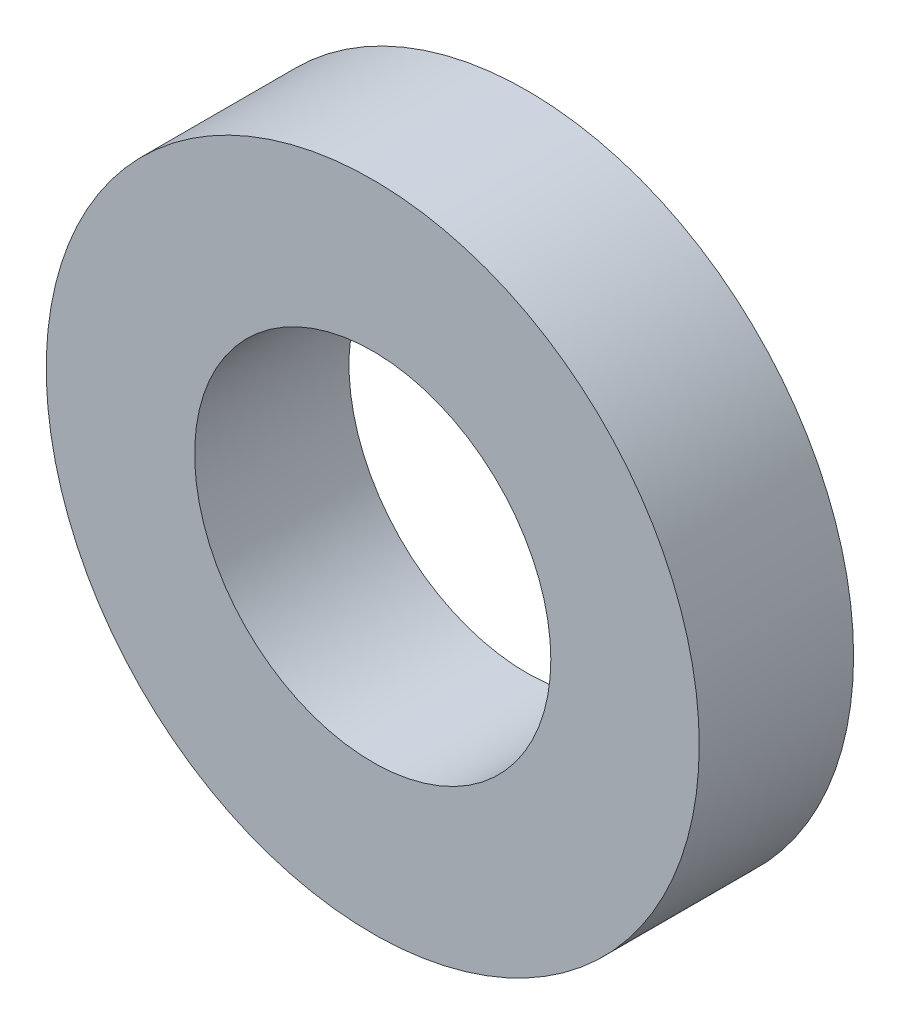
ISO-10303-21;
HEADER;
FILE_DESCRIPTION(('STEP AP214'),'2;1');
FILE_NAME('part.step','',(''),(''),'','','');
FILE_SCHEMA(('AUTOMOTIVE_DESIGN { 1 0 10303 214 1 1 1 1 }'));
ENDSEC;
DATA;
#1=APPLICATION_CONTEXT('core data for automotive mechanical design processes');
#2=APPLICATION_PROTOCOL_DEFINITION('international standard','automotive_design',2000,#1);
#3=PRODUCT_CONTEXT('',#1,'mechanical');
#4=PRODUCT('Part','Part','',(#3));
#5=PRODUCT_RELATED_PRODUCT_CATEGORY('part','',(#4));
#6=PRODUCT_DEFINITION_FORMATION('','',#4);
#7=PRODUCT_DEFINITION_CONTEXT('part definition',#1,'design');
#8=PRODUCT_DEFINITION('design','',#6,#7);
#9=PRODUCT_DEFINITION_SHAPE('','',#8);
#10=(LENGTH_UNIT() NAMED_UNIT(*) SI_UNIT(.MILLI.,.METRE.));
#11=(NAMED_UNIT(*) PLANE_ANGLE_UNIT() SI_UNIT($,.RADIAN.));
#12=(NAMED_UNIT(*) SI_UNIT($,.STERADIAN.) SOLID_ANGLE_UNIT());
#13=UNCERTAINTY_MEASURE_WITH_UNIT(LENGTH_MEASURE(1.E-05),#10,'distance_accuracy_value','');
#14=(GEOMETRIC_REPRESENTATION_CONTEXT(3) GLOBAL_UNCERTAINTY_ASSIGNED_CONTEXT((#13)) GLOBAL_UNIT_ASSIGNED_CONTEXT((#10,
#11,#12)) REPRESENTATION_CONTEXT('',''));
#15=CARTESIAN_POINT('',(0.,0.,0.));
#16=DIRECTION('',(0.,0.,1.));
#17=DIRECTION('',(1.,0.,0.));
#18=AXIS2_PLACEMENT_3D('',#15,#16,#17);
#19=CARTESIAN_POINT('',(0.,27.5,0.));
#20=DIRECTION('',(0.,0.,-1.));
#21=DIRECTION('',(-1.,0.,0.));
#22=AXIS2_PLACEMENT_3D('',#19,#20,#21);
#23=PLANE('',#22);
#24=CARTESIAN_POINT('',(0.,0.,0.));
#25=DIRECTION('',(0.,0.,1.));
#26=DIRECTION('',(1.,0.,0.));
#27=AXIS2_PLACEMENT_3D('',#24,#25,#26);
#28=CIRCLE('',#27,15.);
#29=CARTESIAN_POINT('',(15.,0.,0.));
#30=VERTEX_POINT('',#29);
#31=EDGE_CURVE('E10',#30,#30,#28,.T.);
#32=ORIENTED_EDGE('',*,*,#31,.F.);
#33=EDGE_LOOP('',(#32));
#34=FACE_BOUND('',#33,.T.);
#35=CARTESIAN_POINT('',(0.,0.,0.));
#36=DIRECTION('',(0.,0.,1.));
#37=DIRECTION('',(1.,0.,0.));
#38=AXIS2_PLACEMENT_3D('',#35,#36,#37);
#39=CIRCLE('',#38,27.5);
#40=CARTESIAN_POINT('',(27.5,0.,0.));
#41=VERTEX_POINT('',#40);
#42=EDGE_CURVE('E47',#41,#41,#39,.T.);
#43=ORIENTED_EDGE('',*,*,#42,.T.);
#44=EDGE_LOOP('',(#43));
#45=FACE_BOUND('',#44,.T.);
#46=ADVANCED_FACE('F33',(#34,#45),#23,.F.);
#47=CARTESIAN_POINT('',(0.,0.,0.));
#48=DIRECTION('',(0.,0.,1.));
#49=DIRECTION('',(1.,0.,0.));
#50=AXIS2_PLACEMENT_3D('',#47,#48,#49);
#51=CYLINDRICAL_SURFACE('',#50,15.);
#52=CARTESIAN_POINT('',(0.,0.,-13.));
#53=DIRECTION('',(0.,0.,1.));
#54=DIRECTION('',(1.,0.,0.));
#55=AXIS2_PLACEMENT_3D('',#52,#53,#54);
#56=CIRCLE('',#55,15.);
#57=CARTESIAN_POINT('',(15.,0.,-13.));
#58=VERTEX_POINT('',#57);
#59=EDGE_CURVE('E39',#58,#58,#56,.T.);
#60=ORIENTED_EDGE('',*,*,#59,.F.);
#61=EDGE_LOOP('',(#60));
#62=FACE_BOUND('',#61,.T.);
#63=ORIENTED_EDGE('',*,*,#31,.T.);
#64=EDGE_LOOP('',(#63));
#65=FACE_BOUND('',#64,.T.);
#66=ADVANCED_FACE('F62',(#62,#65),#51,.F.);
#67=CARTESIAN_POINT('',(0.,27.5,-13.));
#68=DIRECTION('',(0.,0.,1.));
#69=DIRECTION('',(1.,0.,0.));
#70=AXIS2_PLACEMENT_3D('',#67,#68,#69);
#71=PLANE('',#70);
#72=CARTESIAN_POINT('',(0.,0.,-13.));
#73=DIRECTION('',(0.,0.,1.));
#74=DIRECTION('',(1.,0.,0.));
#75=AXIS2_PLACEMENT_3D('',#72,#73,#74);
#76=CIRCLE('',#75,27.5);
#77=CARTESIAN_POINT('',(27.5,0.,-13.));
#78=VERTEX_POINT('',#77);
#79=EDGE_CURVE('E43',#78,#78,#76,.T.);
#80=ORIENTED_EDGE('',*,*,#79,.F.);
#81=EDGE_LOOP('',(#80));
#82=FACE_BOUND('',#81,.T.);
#83=ORIENTED_EDGE('',*,*,#59,.T.);
#84=EDGE_LOOP('',(#83));
#85=FACE_BOUND('',#84,.T.);
#86=ADVANCED_FACE('F57',(#82,#85),#71,.F.);
#87=CARTESIAN_POINT('',(0.,0.,0.));
#88=DIRECTION('',(0.,0.,1.));
#89=DIRECTION('',(1.,0.,0.));
#90=AXIS2_PLACEMENT_3D('',#87,#88,#89);
#91=CYLINDRICAL_SURFACE('',#90,27.5);
#92=ORIENTED_EDGE('',*,*,#42,.F.);
#93=EDGE_LOOP('',(#92));
#94=FACE_BOUND('',#93,.T.);
#95=ORIENTED_EDGE('',*,*,#79,.T.);
#96=EDGE_LOOP('',(#95));
#97=FACE_BOUND('',#96,.T.);
#98=ADVANCED_FACE('F54',(#94,#97),#91,.T.);
#99=CLOSED_SHELL('',(#46,#66,#86,#98));
#100=MANIFOLD_SOLID_BREP('B2',#99);
#101=ADVANCED_BREP_SHAPE_REPRESENTATION('',(#18,#100),#14);
#102=SHAPE_DEFINITION_REPRESENTATION(#9,#101);
ENDSEC;
END-ISO-10303-21;
